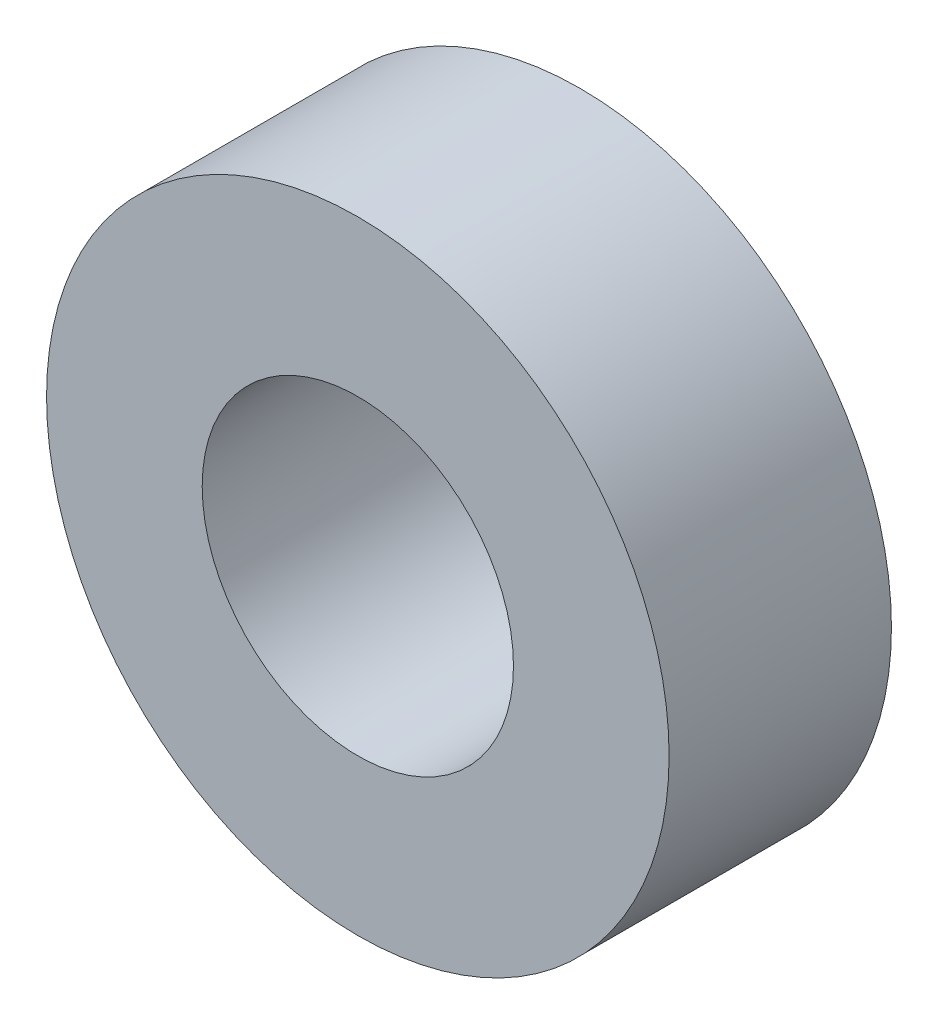
ISO-10303-21;
HEADER;
FILE_DESCRIPTION(('STEP AP214'),'2;1');
FILE_NAME('part.step','',(''),(''),'','','');
FILE_SCHEMA(('AUTOMOTIVE_DESIGN { 1 0 10303 214 1 1 1 1 }'));
ENDSEC;
DATA;
#1=APPLICATION_CONTEXT('core data for automotive mechanical design processes');
#2=APPLICATION_PROTOCOL_DEFINITION('international standard','automotive_design',2000,#1);
#3=PRODUCT_CONTEXT('',#1,'mechanical');
#4=PRODUCT('Part','Part','',(#3));
#5=PRODUCT_RELATED_PRODUCT_CATEGORY('part','',(#4));
#6=PRODUCT_DEFINITION_FORMATION('','',#4);
#7=PRODUCT_DEFINITION_CONTEXT('part definition',#1,'design');
#8=PRODUCT_DEFINITION('design','',#6,#7);
#9=PRODUCT_DEFINITION_SHAPE('','',#8);
#10=(LENGTH_UNIT() NAMED_UNIT(*) SI_UNIT(.MILLI.,.METRE.));
#11=(NAMED_UNIT(*) PLANE_ANGLE_UNIT() SI_UNIT($,.RADIAN.));
#12=(NAMED_UNIT(*) SI_UNIT($,.STERADIAN.) SOLID_ANGLE_UNIT());
#13=UNCERTAINTY_MEASURE_WITH_UNIT(LENGTH_MEASURE(1.E-05),#10,'distance_accuracy_value','');
#14=(GEOMETRIC_REPRESENTATION_CONTEXT(3) GLOBAL_UNCERTAINTY_ASSIGNED_CONTEXT((#13)) GLOBAL_UNIT_ASSIGNED_CONTEXT((#10,
#11,#12)) REPRESENTATION_CONTEXT('',''));
#15=CARTESIAN_POINT('',(0.,0.,0.));
#16=DIRECTION('',(0.,0.,1.));
#17=DIRECTION('',(1.,0.,0.));
#18=AXIS2_PLACEMENT_3D('',#15,#16,#17);
#19=CARTESIAN_POINT('',(0.,0.,2.5));
#20=DIRECTION('',(0.,0.,-1.));
#21=DIRECTION('',(-1.,0.,0.));
#22=AXIS2_PLACEMENT_3D('',#19,#20,#21);
#23=CYLINDRICAL_SURFACE('',#22,7.);
#24=CARTESIAN_POINT('',(0.,0.,2.5));
#25=DIRECTION('',(0.,0.,1.));
#26=DIRECTION('',(1.,0.,0.));
#27=AXIS2_PLACEMENT_3D('',#24,#25,#26);
#28=CIRCLE('',#27,7.);
#29=CARTESIAN_POINT('',(7.,0.,2.5));
#30=VERTEX_POINT('',#29);
#31=EDGE_CURVE('E10',#30,#30,#28,.T.);
#32=ORIENTED_EDGE('',*,*,#31,.F.);
#33=EDGE_LOOP('',(#32));
#34=FACE_BOUND('',#33,.T.);
#35=CARTESIAN_POINT('',(0.,0.,-2.5));
#36=DIRECTION('',(0.,0.,1.));
#37=DIRECTION('',(1.,0.,0.));
#38=AXIS2_PLACEMENT_3D('',#35,#36,#37);
#39=CIRCLE('',#38,7.);
#40=CARTESIAN_POINT('',(7.,0.,-2.5));
#41=VERTEX_POINT('',#40);
#42=EDGE_CURVE('E46',#41,#41,#39,.T.);
#43=ORIENTED_EDGE('',*,*,#42,.T.);
#44=EDGE_LOOP('',(#43));
#45=FACE_BOUND('',#44,.T.);
#46=ADVANCED_FACE('F39',(#34,#45),#23,.T.);
#47=CARTESIAN_POINT('',(0.,0.,2.5));
#48=DIRECTION('',(0.,0.,1.));
#49=DIRECTION('',(1.,0.,0.));
#50=AXIS2_PLACEMENT_3D('',#47,#48,#49);
#51=PLANE('',#50);
#52=CARTESIAN_POINT('',(0.,0.,2.5));
#53=DIRECTION('',(0.,0.,1.));
#54=DIRECTION('',(1.,0.,0.));
#55=AXIS2_PLACEMENT_3D('',#52,#53,#54);
#56=CIRCLE('',#55,3.5);
#57=CARTESIAN_POINT('',(3.5,0.,2.5));
#58=VERTEX_POINT('',#57);
#59=EDGE_CURVE('E51',#58,#58,#56,.F.);
#60=ORIENTED_EDGE('',*,*,#59,.T.);
#61=EDGE_LOOP('',(#60));
#62=FACE_BOUND('',#61,.T.);
#63=ORIENTED_EDGE('',*,*,#31,.T.);
#64=EDGE_LOOP('',(#63));
#65=FACE_BOUND('',#64,.T.);
#66=ADVANCED_FACE('F64',(#62,#65),#51,.T.);
#67=CARTESIAN_POINT('',(0.,0.,-2.5));
#68=DIRECTION('',(0.,0.,1.));
#69=DIRECTION('',(1.,0.,0.));
#70=AXIS2_PLACEMENT_3D('',#67,#68,#69);
#71=PLANE('',#70);
#72=CARTESIAN_POINT('',(0.,0.,-2.5));
#73=DIRECTION('',(0.,0.,1.));
#74=DIRECTION('',(1.,0.,0.));
#75=AXIS2_PLACEMENT_3D('',#72,#73,#74);
#76=CIRCLE('',#75,3.5);
#77=CARTESIAN_POINT('',(3.5,0.,-2.5));
#78=VERTEX_POINT('',#77);
#79=EDGE_CURVE('E42',#78,#78,#76,.F.);
#80=ORIENTED_EDGE('',*,*,#79,.F.);
#81=EDGE_LOOP('',(#80));
#82=FACE_BOUND('',#81,.T.);
#83=ORIENTED_EDGE('',*,*,#42,.F.);
#84=EDGE_LOOP('',(#83));
#85=FACE_BOUND('',#84,.T.);
#86=ADVANCED_FACE('F61',(#82,#85),#71,.F.);
#87=CARTESIAN_POINT('',(0.,0.,3.));
#88=DIRECTION('',(0.,0.,-1.));
#89=DIRECTION('',(-1.,0.,0.));
#90=AXIS2_PLACEMENT_3D('',#87,#88,#89);
#91=CYLINDRICAL_SURFACE('',#90,3.5);
#92=ORIENTED_EDGE('',*,*,#59,.F.);
#93=EDGE_LOOP('',(#92));
#94=FACE_BOUND('',#93,.T.);
#95=ORIENTED_EDGE('',*,*,#79,.T.);
#96=EDGE_LOOP('',(#95));
#97=FACE_BOUND('',#96,.T.);
#98=ADVANCED_FACE('F59',(#94,#97),#91,.F.);
#99=CLOSED_SHELL('',(#46,#66,#86,#98));
#100=MANIFOLD_SOLID_BREP('B2',#99);
#101=ADVANCED_BREP_SHAPE_REPRESENTATION('',(#18,#100),#14);
#102=SHAPE_DEFINITION_REPRESENTATION(#9,#101);
ENDSEC;
END-ISO-10303-21;
